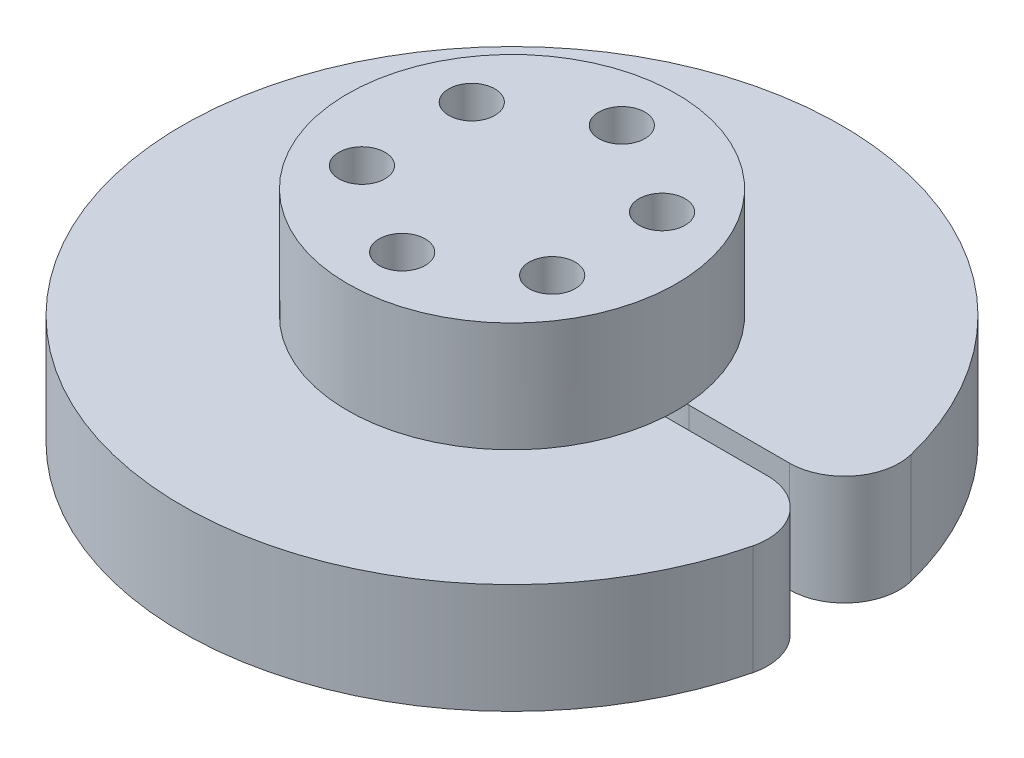
ISO-10303-21;
HEADER;
FILE_DESCRIPTION(('STEP AP214'),'2;1');
FILE_NAME('part.step','',(''),(''),'','','');
FILE_SCHEMA(('AUTOMOTIVE_DESIGN { 1 0 10303 214 1 1 1 1 }'));
ENDSEC;
DATA;
#1=APPLICATION_CONTEXT('core data for automotive mechanical design processes');
#2=APPLICATION_PROTOCOL_DEFINITION('international standard','automotive_design',2000,#1);
#3=PRODUCT_CONTEXT('',#1,'mechanical');
#4=PRODUCT('Part','Part','',(#3));
#5=PRODUCT_RELATED_PRODUCT_CATEGORY('part','',(#4));
#6=PRODUCT_DEFINITION_FORMATION('','',#4);
#7=PRODUCT_DEFINITION_CONTEXT('part definition',#1,'design');
#8=PRODUCT_DEFINITION('design','',#6,#7);
#9=PRODUCT_DEFINITION_SHAPE('','',#8);
#10=(LENGTH_UNIT() NAMED_UNIT(*) SI_UNIT(.MILLI.,.METRE.));
#11=(NAMED_UNIT(*) PLANE_ANGLE_UNIT() SI_UNIT($,.RADIAN.));
#12=(NAMED_UNIT(*) SI_UNIT($,.STERADIAN.) SOLID_ANGLE_UNIT());
#13=UNCERTAINTY_MEASURE_WITH_UNIT(LENGTH_MEASURE(1.E-05),#10,'distance_accuracy_value','');
#14=(GEOMETRIC_REPRESENTATION_CONTEXT(3) GLOBAL_UNCERTAINTY_ASSIGNED_CONTEXT((#13)) GLOBAL_UNIT_ASSIGNED_CONTEXT((#10,
#11,#12)) REPRESENTATION_CONTEXT('',''));
#15=CARTESIAN_POINT('',(0.,0.,0.));
#16=DIRECTION('',(0.,0.,1.));
#17=DIRECTION('',(1.,0.,0.));
#18=AXIS2_PLACEMENT_3D('',#15,#16,#17);
#19=CARTESIAN_POINT('',(0.,10.,0.));
#20=DIRECTION('',(0.,-1.,0.));
#21=DIRECTION('',(0.,0.,-1.));
#22=AXIS2_PLACEMENT_3D('',#19,#20,#21);
#23=CYLINDRICAL_SURFACE('',#22,30.);
#24=CARTESIAN_POINT('',(0.,10.,0.));
#25=DIRECTION('',(0.,1.,0.));
#26=DIRECTION('',(0.,0.,1.));
#27=AXIS2_PLACEMENT_3D('',#24,#25,#26);
#28=CIRCLE('',#27,30.);
#29=CARTESIAN_POINT('',(29.1231866388278,10.,-7.2));
#30=VERTEX_POINT('',#29);
#31=CARTESIAN_POINT('',(29.1231866388278,10.,7.2));
#32=VERTEX_POINT('',#31);
#33=EDGE_CURVE('E222',#30,#32,#28,.T.);
#34=ORIENTED_EDGE('',*,*,#33,.F.);
#35=DIRECTION('',(0.,-1.,0.));
#36=VECTOR('',#35,1.);
#37=CARTESIAN_POINT('',(29.1231866388278,10.,-7.2));
#38=LINE('',#37,#36);
#39=CARTESIAN_POINT('',(29.1231866388278,0.,-7.2));
#40=VERTEX_POINT('',#39);
#41=EDGE_CURVE('E248',#30,#40,#38,.T.);
#42=ORIENTED_EDGE('',*,*,#41,.T.);
#43=CARTESIAN_POINT('',(0.,0.,0.));
#44=DIRECTION('',(0.,1.,0.));
#45=DIRECTION('',(0.,0.,1.));
#46=AXIS2_PLACEMENT_3D('',#43,#44,#45);
#47=CIRCLE('',#46,30.);
#48=CARTESIAN_POINT('',(29.1231866388278,0.,7.2));
#49=VERTEX_POINT('',#48);
#50=EDGE_CURVE('E219',#40,#49,#47,.T.);
#51=ORIENTED_EDGE('',*,*,#50,.T.);
#52=DIRECTION('',(0.,-1.,0.));
#53=VECTOR('',#52,1.);
#54=CARTESIAN_POINT('',(29.1231866388278,10.,7.2));
#55=LINE('',#54,#53);
#56=EDGE_CURVE('E245',#49,#32,#55,.F.);
#57=ORIENTED_EDGE('',*,*,#56,.T.);
#58=EDGE_LOOP('',(#34,#42,#51,#57));
#59=FACE_BOUND('',#58,.T.);
#60=ADVANCED_FACE('F42',(#59),#23,.T.);
#61=CARTESIAN_POINT('',(0.,10.,0.));
#62=DIRECTION('',(0.,1.,0.));
#63=DIRECTION('',(0.,0.,1.));
#64=AXIS2_PLACEMENT_3D('',#61,#62,#63);
#65=PLANE('',#64);
#66=DIRECTION('',(-1.,0.,0.));
#67=VECTOR('',#66,1.);
#68=CARTESIAN_POINT('',(10.9342801502242,10.,-1.));
#69=LINE('',#68,#67);
#70=CARTESIAN_POINT('',(24.2693221990232,10.,-1.));
#71=VERTEX_POINT('',#70);
#72=CARTESIAN_POINT('',(15.114070564733,10.,-1.));
#73=VERTEX_POINT('',#72);
#74=EDGE_CURVE('E166',#71,#73,#69,.T.);
#75=ORIENTED_EDGE('',*,*,#74,.F.);
#76=CARTESIAN_POINT('',(24.2693221990232,10.,-6.));
#77=DIRECTION('',(0.,1.,0.));
#78=DIRECTION('',(0.,0.,1.));
#79=AXIS2_PLACEMENT_3D('',#76,#77,#78);
#80=CIRCLE('',#79,5.);
#81=EDGE_CURVE('E259',#71,#30,#80,.T.);
#82=ORIENTED_EDGE('',*,*,#81,.T.);
#83=ORIENTED_EDGE('',*,*,#33,.T.);
#84=CARTESIAN_POINT('',(24.2693221990232,10.,6.));
#85=DIRECTION('',(0.,1.,0.));
#86=DIRECTION('',(0.,0.,1.));
#87=AXIS2_PLACEMENT_3D('',#84,#85,#86);
#88=CIRCLE('',#87,5.);
#89=CARTESIAN_POINT('',(24.2693221990232,10.,1.));
#90=VERTEX_POINT('',#89);
#91=EDGE_CURVE('E257',#32,#90,#88,.T.);
#92=ORIENTED_EDGE('',*,*,#91,.T.);
#93=DIRECTION('',(1.,0.,0.));
#94=VECTOR('',#93,1.);
#95=CARTESIAN_POINT('',(10.9342801502242,10.,1.));
#96=LINE('',#95,#94);
#97=CARTESIAN_POINT('',(15.114070564733,10.,1.));
#98=VERTEX_POINT('',#97);
#99=EDGE_CURVE('E162',#98,#90,#96,.T.);
#100=ORIENTED_EDGE('',*,*,#99,.F.);
#101=CARTESIAN_POINT('',(15.114070564733,10.,11.));
#102=DIRECTION('',(0.,1.,0.));
#103=DIRECTION('',(0.,0.,1.));
#104=AXIS2_PLACEMENT_3D('',#101,#102,#103);
#105=CIRCLE('',#104,10.);
#106=CARTESIAN_POINT('',(14.9414739433517,10.,1.00148959062962));
#107=VERTEX_POINT('',#106);
#108=EDGE_CURVE('E157',#98,#107,#105,.T.);
#109=ORIENTED_EDGE('',*,*,#108,.T.);
#110=CARTESIAN_POINT('',(0.,10.,0.));
#111=DIRECTION('',(0.,1.,0.));
#112=DIRECTION('',(0.,0.,1.));
#113=AXIS2_PLACEMENT_3D('',#110,#111,#112);
#114=CIRCLE('',#113,14.975);
#115=CARTESIAN_POINT('',(14.9414739433517,10.,-1.00148959062962));
#116=VERTEX_POINT('',#115);
#117=EDGE_CURVE('E221',#116,#107,#114,.T.);
#118=ORIENTED_EDGE('',*,*,#117,.F.);
#119=CARTESIAN_POINT('',(15.114070564733,10.,-11.));
#120=DIRECTION('',(0.,1.,0.));
#121=DIRECTION('',(0.,0.,1.));
#122=AXIS2_PLACEMENT_3D('',#119,#120,#121);
#123=CIRCLE('',#122,10.);
#124=EDGE_CURVE('E143',#116,#73,#123,.T.);
#125=ORIENTED_EDGE('',*,*,#124,.T.);
#126=EDGE_LOOP('',(#75,#82,#83,#92,#100,#109,#118,#125));
#127=FACE_BOUND('',#126,.T.);
#128=ADVANCED_FACE('F311',(#127),#65,.T.);
#129=CARTESIAN_POINT('',(0.,0.,0.));
#130=DIRECTION('',(0.,1.,0.));
#131=DIRECTION('',(0.,0.,1.));
#132=AXIS2_PLACEMENT_3D('',#129,#130,#131);
#133=PLANE('',#132);
#134=ORIENTED_EDGE('',*,*,#50,.F.);
#135=CARTESIAN_POINT('',(24.2693221990232,0.,-6.));
#136=DIRECTION('',(0.,1.,0.));
#137=DIRECTION('',(0.,0.,1.));
#138=AXIS2_PLACEMENT_3D('',#135,#136,#137);
#139=CIRCLE('',#138,5.);
#140=CARTESIAN_POINT('',(24.2693221990232,0.,-1.));
#141=VERTEX_POINT('',#140);
#142=EDGE_CURVE('E253',#40,#141,#139,.F.);
#143=ORIENTED_EDGE('',*,*,#142,.T.);
#144=DIRECTION('',(-1.,0.,0.));
#145=VECTOR('',#144,1.);
#146=CARTESIAN_POINT('',(0.,0.,-1.));
#147=LINE('',#146,#145);
#148=CARTESIAN_POINT('',(15.114070564733,0.,-1.));
#149=VERTEX_POINT('',#148);
#150=EDGE_CURVE('E178',#141,#149,#147,.T.);
#151=ORIENTED_EDGE('',*,*,#150,.T.);
#152=CARTESIAN_POINT('',(15.114070564733,0.,-11.));
#153=DIRECTION('',(0.,1.,0.));
#154=DIRECTION('',(0.,0.,1.));
#155=AXIS2_PLACEMENT_3D('',#152,#153,#154);
#156=CIRCLE('',#155,10.);
#157=CARTESIAN_POINT('',(14.7176297725128,0.,-1.00786135513203));
#158=VERTEX_POINT('',#157);
#159=EDGE_CURVE('E56',#149,#158,#156,.F.);
#160=ORIENTED_EDGE('',*,*,#159,.T.);
#161=CARTESIAN_POINT('',(14.7255585883572,0.,-1.20770412802939));
#162=DIRECTION('',(0.,1.,0.));
#163=DIRECTION('',(0.,0.,1.));
#164=AXIS2_PLACEMENT_3D('',#161,#162,#163);
#165=CIRCLE('',#164,0.2);
#166=CARTESIAN_POINT('',(14.92488933067,0.,-1.22405206884874));
#167=VERTEX_POINT('',#166);
#168=EDGE_CURVE('E11',#158,#167,#165,.T.);
#169=ORIENTED_EDGE('',*,*,#168,.T.);
#170=CARTESIAN_POINT('',(0.,0.,0.));
#171=DIRECTION('',(0.,-1.,0.));
#172=DIRECTION('',(0.,0.,-1.));
#173=AXIS2_PLACEMENT_3D('',#170,#171,#172);
#174=CIRCLE('',#173,14.975);
#175=CARTESIAN_POINT('',(14.92488933067,0.,1.22405206884874));
#176=VERTEX_POINT('',#175);
#177=EDGE_CURVE('E213',#176,#167,#174,.T.);
#178=ORIENTED_EDGE('',*,*,#177,.F.);
#179=CARTESIAN_POINT('',(14.7255585883572,0.,1.20770412802939));
#180=DIRECTION('',(0.,1.,0.));
#181=DIRECTION('',(0.,0.,1.));
#182=AXIS2_PLACEMENT_3D('',#179,#180,#181);
#183=CIRCLE('',#182,0.2);
#184=CARTESIAN_POINT('',(14.7176297725128,0.,1.00786135513203));
#185=VERTEX_POINT('',#184);
#186=EDGE_CURVE('E50',#176,#185,#183,.T.);
#187=ORIENTED_EDGE('',*,*,#186,.T.);
#188=CARTESIAN_POINT('',(15.114070564733,0.,11.));
#189=DIRECTION('',(0.,1.,0.));
#190=DIRECTION('',(0.,0.,1.));
#191=AXIS2_PLACEMENT_3D('',#188,#189,#190);
#192=CIRCLE('',#191,10.);
#193=CARTESIAN_POINT('',(15.114070564733,0.,1.));
#194=VERTEX_POINT('',#193);
#195=EDGE_CURVE('E234',#185,#194,#192,.F.);
#196=ORIENTED_EDGE('',*,*,#195,.T.);
#197=DIRECTION('',(1.,0.,0.));
#198=VECTOR('',#197,1.);
#199=CARTESIAN_POINT('',(0.,0.,1.));
#200=LINE('',#199,#198);
#201=CARTESIAN_POINT('',(24.2693221990232,0.,1.));
#202=VERTEX_POINT('',#201);
#203=EDGE_CURVE('E175',#194,#202,#200,.T.);
#204=ORIENTED_EDGE('',*,*,#203,.T.);
#205=CARTESIAN_POINT('',(24.2693221990232,0.,6.));
#206=DIRECTION('',(0.,1.,0.));
#207=DIRECTION('',(0.,0.,1.));
#208=AXIS2_PLACEMENT_3D('',#205,#206,#207);
#209=CIRCLE('',#208,5.);
#210=EDGE_CURVE('E251',#202,#49,#209,.F.);
#211=ORIENTED_EDGE('',*,*,#210,.T.);
#212=EDGE_LOOP('',(#134,#143,#151,#160,#169,#178,#187,#196,#204,#211));
#213=FACE_BOUND('',#212,.T.);
#214=ADVANCED_FACE('F279',(#213),#133,.F.);
#215=CARTESIAN_POINT('',(0.,20.,0.));
#216=DIRECTION('',(0.,-1.,0.));
#217=DIRECTION('',(0.,0.,-1.));
#218=AXIS2_PLACEMENT_3D('',#215,#216,#217);
#219=CYLINDRICAL_SURFACE('',#218,14.975);
#220=CARTESIAN_POINT('',(0.,20.,0.));
#221=DIRECTION('',(0.,1.,0.));
#222=DIRECTION('',(0.,0.,1.));
#223=AXIS2_PLACEMENT_3D('',#220,#221,#222);
#224=CIRCLE('',#223,14.975);
#225=CARTESIAN_POINT('',(0.,20.,14.975));
#226=VERTEX_POINT('',#225);
#227=EDGE_CURVE('E212',#226,#226,#224,.T.);
#228=ORIENTED_EDGE('',*,*,#227,.F.);
#229=EDGE_LOOP('',(#228));
#230=FACE_BOUND('',#229,.T.);
#231=EDGE_CURVE('E216',#107,#116,#114,.T.);
#232=ORIENTED_EDGE('',*,*,#231,.T.);
#233=ORIENTED_EDGE('',*,*,#117,.T.);
#234=EDGE_LOOP('',(#232,#233));
#235=FACE_BOUND('',#234,.T.);
#236=ADVANCED_FACE('F307',(#230,#235),#219,.T.);
#237=CARTESIAN_POINT('',(0.,20.,0.));
#238=DIRECTION('',(0.,1.,0.));
#239=DIRECTION('',(0.,0.,1.));
#240=AXIS2_PLACEMENT_3D('',#237,#238,#239);
#241=PLANE('',#240);
#242=CARTESIAN_POINT('',(-8.66025403784437,20.,5.00000000000003));
#243=DIRECTION('',(0.,1.,0.));
#244=DIRECTION('',(0.,0.,1.));
#245=AXIS2_PLACEMENT_3D('',#242,#243,#244);
#246=CIRCLE('',#245,2.1);
#247=CARTESIAN_POINT('',(-8.66025403784437,20.,7.10000000000003));
#248=VERTEX_POINT('',#247);
#249=EDGE_CURVE('E792',#248,#248,#246,.T.);
#250=ORIENTED_EDGE('',*,*,#249,.F.);
#251=EDGE_LOOP('',(#250));
#252=FACE_BOUND('',#251,.T.);
#253=CARTESIAN_POINT('',(0.,20.,10.));
#254=DIRECTION('',(0.,1.,0.));
#255=DIRECTION('',(0.,0.,1.));
#256=AXIS2_PLACEMENT_3D('',#253,#254,#255);
#257=CIRCLE('',#256,2.1);
#258=CARTESIAN_POINT('',(0.,20.,12.1));
#259=VERTEX_POINT('',#258);
#260=EDGE_CURVE('E829',#259,#259,#257,.T.);
#261=ORIENTED_EDGE('',*,*,#260,.F.);
#262=EDGE_LOOP('',(#261));
#263=FACE_BOUND('',#262,.T.);
#264=CARTESIAN_POINT('',(8.6602540378444,20.,4.99999999999998));
#265=DIRECTION('',(0.,1.,0.));
#266=DIRECTION('',(0.,0.,1.));
#267=AXIS2_PLACEMENT_3D('',#264,#265,#266);
#268=CIRCLE('',#267,2.1);
#269=CARTESIAN_POINT('',(8.6602540378444,20.,7.09999999999997));
#270=VERTEX_POINT('',#269);
#271=EDGE_CURVE('E823',#270,#270,#268,.T.);
#272=ORIENTED_EDGE('',*,*,#271,.F.);
#273=EDGE_LOOP('',(#272));
#274=FACE_BOUND('',#273,.T.);
#275=CARTESIAN_POINT('',(8.66025403784437,20.,-5.00000000000002));
#276=DIRECTION('',(0.,1.,0.));
#277=DIRECTION('',(0.,0.,1.));
#278=AXIS2_PLACEMENT_3D('',#275,#276,#277);
#279=CIRCLE('',#278,2.1);
#280=CARTESIAN_POINT('',(8.66025403784437,20.,-2.90000000000002));
#281=VERTEX_POINT('',#280);
#282=EDGE_CURVE('E815',#281,#281,#279,.T.);
#283=ORIENTED_EDGE('',*,*,#282,.F.);
#284=EDGE_LOOP('',(#283));
#285=FACE_BOUND('',#284,.T.);
#286=CARTESIAN_POINT('',(0.,20.,-10.));
#287=DIRECTION('',(0.,1.,0.));
#288=DIRECTION('',(0.,0.,1.));
#289=AXIS2_PLACEMENT_3D('',#286,#287,#288);
#290=CIRCLE('',#289,2.1);
#291=CARTESIAN_POINT('',(0.,20.,-7.90000000000001));
#292=VERTEX_POINT('',#291);
#293=EDGE_CURVE('E804',#292,#292,#290,.T.);
#294=ORIENTED_EDGE('',*,*,#293,.F.);
#295=EDGE_LOOP('',(#294));
#296=FACE_BOUND('',#295,.T.);
#297=CARTESIAN_POINT('',(-8.6602540378444,20.,-4.99999999999998));
#298=DIRECTION('',(0.,1.,0.));
#299=DIRECTION('',(0.,0.,1.));
#300=AXIS2_PLACEMENT_3D('',#297,#298,#299);
#301=CIRCLE('',#300,2.1);
#302=CARTESIAN_POINT('',(-8.6602540378444,20.,-2.89999999999998));
#303=VERTEX_POINT('',#302);
#304=EDGE_CURVE('E802',#303,#303,#301,.T.);
#305=ORIENTED_EDGE('',*,*,#304,.F.);
#306=EDGE_LOOP('',(#305));
#307=FACE_BOUND('',#306,.T.);
#308=ORIENTED_EDGE('',*,*,#227,.T.);
#309=EDGE_LOOP('',(#308));
#310=FACE_BOUND('',#309,.T.);
#311=ADVANCED_FACE('F299',(#252,#263,#274,#285,#296,#307,#310),#241,.T.);
#312=CARTESIAN_POINT('',(0.,-6.,0.));
#313=DIRECTION('',(0.,1.,0.));
#314=DIRECTION('',(0.,0.,1.));
#315=AXIS2_PLACEMENT_3D('',#312,#313,#314);
#316=CYLINDRICAL_SURFACE('',#315,14.975);
#317=CARTESIAN_POINT('',(0.,-6.,0.));
#318=DIRECTION('',(0.,-1.,0.));
#319=DIRECTION('',(0.,0.,-1.));
#320=AXIS2_PLACEMENT_3D('',#317,#318,#319);
#321=CIRCLE('',#320,14.975);
#322=CARTESIAN_POINT('',(14.92488933067,-6.,1.22405206884874));
#323=VERTEX_POINT('',#322);
#324=CARTESIAN_POINT('',(14.92488933067,-6.,-1.22405206884874));
#325=VERTEX_POINT('',#324);
#326=EDGE_CURVE('E184',#323,#325,#321,.T.);
#327=ORIENTED_EDGE('',*,*,#326,.F.);
#328=DIRECTION('',(0.,1.,0.));
#329=VECTOR('',#328,1.);
#330=CARTESIAN_POINT('',(14.92488933067,-6.,1.22405206884874));
#331=LINE('',#330,#329);
#332=EDGE_CURVE('E266',#323,#176,#331,.T.);
#333=ORIENTED_EDGE('',*,*,#332,.T.);
#334=ORIENTED_EDGE('',*,*,#177,.T.);
#335=DIRECTION('',(0.,1.,0.));
#336=VECTOR('',#335,1.);
#337=CARTESIAN_POINT('',(14.92488933067,-6.,-1.22405206884874));
#338=LINE('',#337,#336);
#339=EDGE_CURVE('E263',#167,#325,#338,.F.);
#340=ORIENTED_EDGE('',*,*,#339,.T.);
#341=EDGE_LOOP('',(#327,#333,#334,#340));
#342=FACE_BOUND('',#341,.T.);
#343=ADVANCED_FACE('F297',(#342),#316,.T.);
#344=CARTESIAN_POINT('',(0.,-6.,0.));
#345=DIRECTION('',(0.,-1.,0.));
#346=DIRECTION('',(0.,0.,-1.));
#347=AXIS2_PLACEMENT_3D('',#344,#345,#346);
#348=PLANE('',#347);
#349=CARTESIAN_POINT('',(15.114070564733,-6.,11.));
#350=DIRECTION('',(0.,-1.,0.));
#351=DIRECTION('',(0.,0.,-1.));
#352=AXIS2_PLACEMENT_3D('',#349,#350,#351);
#353=CIRCLE('',#352,10.);
#354=CARTESIAN_POINT('',(9.68348234737956,-6.,2.6030534351145));
#355=VERTEX_POINT('',#354);
#356=CARTESIAN_POINT('',(14.7176297725128,-6.,1.00786135513203));
#357=VERTEX_POINT('',#356);
#358=EDGE_CURVE('E237',#355,#357,#353,.T.);
#359=ORIENTED_EDGE('',*,*,#358,.T.);
#360=CARTESIAN_POINT('',(14.7255585883572,-6.,1.20770412802939));
#361=DIRECTION('',(0.,-1.,0.));
#362=DIRECTION('',(0.,0.,-1.));
#363=AXIS2_PLACEMENT_3D('',#360,#361,#362);
#364=CIRCLE('',#363,0.2);
#365=EDGE_CURVE('E272',#357,#323,#364,.T.);
#366=ORIENTED_EDGE('',*,*,#365,.T.);
#367=ORIENTED_EDGE('',*,*,#326,.T.);
#368=CARTESIAN_POINT('',(14.7255585883572,-6.,-1.20770412802939));
#369=DIRECTION('',(0.,-1.,0.));
#370=DIRECTION('',(0.,0.,-1.));
#371=AXIS2_PLACEMENT_3D('',#368,#369,#370);
#372=CIRCLE('',#371,0.2);
#373=CARTESIAN_POINT('',(14.7176297725128,-6.,-1.00786135513203));
#374=VERTEX_POINT('',#373);
#375=EDGE_CURVE('E64',#325,#374,#372,.T.);
#376=ORIENTED_EDGE('',*,*,#375,.T.);
#377=CARTESIAN_POINT('',(15.114070564733,-6.,-11.));
#378=DIRECTION('',(0.,-1.,0.));
#379=DIRECTION('',(0.,0.,-1.));
#380=AXIS2_PLACEMENT_3D('',#377,#378,#379);
#381=CIRCLE('',#380,10.);
#382=CARTESIAN_POINT('',(9.68348234737956,-6.,-2.6030534351145));
#383=VERTEX_POINT('',#382);
#384=EDGE_CURVE('E240',#374,#383,#381,.T.);
#385=ORIENTED_EDGE('',*,*,#384,.T.);
#386=CARTESIAN_POINT('',(8.,-6.,0.));
#387=DIRECTION('',(0.,1.,0.));
#388=DIRECTION('',(0.,0.,1.));
#389=AXIS2_PLACEMENT_3D('',#386,#387,#388);
#390=CIRCLE('',#389,3.1);
#391=EDGE_CURVE('E156',#383,#355,#390,.T.);
#392=ORIENTED_EDGE('',*,*,#391,.T.);
#393=EDGE_LOOP('',(#359,#366,#367,#376,#385,#392));
#394=FACE_BOUND('',#393,.T.);
#395=CARTESIAN_POINT('',(-10.,-6.,0.));
#396=DIRECTION('',(0.,-1.,0.));
#397=DIRECTION('',(0.,0.,-1.));
#398=AXIS2_PLACEMENT_3D('',#395,#396,#397);
#399=CIRCLE('',#398,2.1);
#400=CARTESIAN_POINT('',(-10.,-6.,-2.1));
#401=VERTEX_POINT('',#400);
#402=EDGE_CURVE('E185',#401,#401,#399,.T.);
#403=ORIENTED_EDGE('',*,*,#402,.F.);
#404=EDGE_LOOP('',(#403));
#405=FACE_BOUND('',#404,.T.);
#406=CARTESIAN_POINT('',(-5.,-6.,8.66025403784439));
#407=DIRECTION('',(0.,-1.,0.));
#408=DIRECTION('',(0.,0.,-1.));
#409=AXIS2_PLACEMENT_3D('',#406,#407,#408);
#410=CIRCLE('',#409,2.1);
#411=CARTESIAN_POINT('',(-5.,-6.,6.56025403784438));
#412=VERTEX_POINT('',#411);
#413=EDGE_CURVE('E188',#412,#412,#410,.T.);
#414=ORIENTED_EDGE('',*,*,#413,.F.);
#415=EDGE_LOOP('',(#414));
#416=FACE_BOUND('',#415,.T.);
#417=CARTESIAN_POINT('',(5.,-6.,8.66025403784439));
#418=DIRECTION('',(0.,-1.,0.));
#419=DIRECTION('',(0.,0.,-1.));
#420=AXIS2_PLACEMENT_3D('',#417,#418,#419);
#421=CIRCLE('',#420,2.1);
#422=CARTESIAN_POINT('',(5.,-6.,6.56025403784439));
#423=VERTEX_POINT('',#422);
#424=EDGE_CURVE('E194',#423,#423,#421,.T.);
#425=ORIENTED_EDGE('',*,*,#424,.F.);
#426=EDGE_LOOP('',(#425));
#427=FACE_BOUND('',#426,.T.);
#428=CARTESIAN_POINT('',(5.,-6.,-8.66025403784439));
#429=DIRECTION('',(0.,-1.,0.));
#430=DIRECTION('',(0.,0.,-1.));
#431=AXIS2_PLACEMENT_3D('',#428,#429,#430);
#432=CIRCLE('',#431,2.1);
#433=CARTESIAN_POINT('',(5.,-6.,-10.7602540378444));
#434=VERTEX_POINT('',#433);
#435=EDGE_CURVE('E200',#434,#434,#432,.T.);
#436=ORIENTED_EDGE('',*,*,#435,.F.);
#437=EDGE_LOOP('',(#436));
#438=FACE_BOUND('',#437,.T.);
#439=CARTESIAN_POINT('',(-4.99999999999999,-6.,-8.66025403784439));
#440=DIRECTION('',(0.,-1.,0.));
#441=DIRECTION('',(0.,0.,-1.));
#442=AXIS2_PLACEMENT_3D('',#439,#440,#441);
#443=CIRCLE('',#442,2.1);
#444=CARTESIAN_POINT('',(-4.99999999999999,-6.,-10.7602540378444));
#445=VERTEX_POINT('',#444);
#446=EDGE_CURVE('E206',#445,#445,#443,.T.);
#447=ORIENTED_EDGE('',*,*,#446,.F.);
#448=EDGE_LOOP('',(#447));
#449=FACE_BOUND('',#448,.T.);
#450=ADVANCED_FACE('F289',(#394,#405,#416,#427,#438,#449),#348,.T.);
#451=CARTESIAN_POINT('',(-4.99999999999999,10.,-8.66025403784439));
#452=DIRECTION('',(0.,-1.,0.));
#453=DIRECTION('',(0.,0.,-1.));
#454=AXIS2_PLACEMENT_3D('',#451,#452,#453);
#455=CYLINDRICAL_SURFACE('',#454,2.1);
#456=CARTESIAN_POINT('',(-4.99999999999999,10.,-8.66025403784439));
#457=DIRECTION('',(0.,-1.,0.));
#458=DIRECTION('',(0.,0.,-1.));
#459=AXIS2_PLACEMENT_3D('',#456,#457,#458);
#460=CIRCLE('',#459,2.1);
#461=CARTESIAN_POINT('',(-4.99999999999999,10.,-10.7602540378444));
#462=VERTEX_POINT('',#461);
#463=EDGE_CURVE('E180',#462,#462,#460,.T.);
#464=ORIENTED_EDGE('',*,*,#463,.F.);
#465=EDGE_LOOP('',(#464));
#466=FACE_BOUND('',#465,.T.);
#467=ORIENTED_EDGE('',*,*,#446,.T.);
#468=EDGE_LOOP('',(#467));
#469=FACE_BOUND('',#468,.T.);
#470=ADVANCED_FACE('F305',(#466,#469),#455,.F.);
#471=CARTESIAN_POINT('',(-4.99999999999999,10.,-8.66025403784439));
#472=DIRECTION('',(0.,-1.,0.));
#473=DIRECTION('',(0.,0.,-1.));
#474=AXIS2_PLACEMENT_3D('',#471,#472,#473);
#475=PLANE('',#474);
#476=ORIENTED_EDGE('',*,*,#463,.T.);
#477=EDGE_LOOP('',(#476));
#478=FACE_BOUND('',#477,.T.);
#479=ADVANCED_FACE('F396',(#478),#475,.T.);
#480=CARTESIAN_POINT('',(5.,10.,-8.66025403784439));
#481=DIRECTION('',(0.,-1.,0.));
#482=DIRECTION('',(0.,0.,-1.));
#483=AXIS2_PLACEMENT_3D('',#480,#481,#482);
#484=CYLINDRICAL_SURFACE('',#483,2.1);
#485=CARTESIAN_POINT('',(5.,10.,-8.66025403784439));
#486=DIRECTION('',(0.,-1.,0.));
#487=DIRECTION('',(0.,0.,-1.));
#488=AXIS2_PLACEMENT_3D('',#485,#486,#487);
#489=CIRCLE('',#488,2.1);
#490=CARTESIAN_POINT('',(5.,10.,-10.7602540378444));
#491=VERTEX_POINT('',#490);
#492=EDGE_CURVE('E203',#491,#491,#489,.T.);
#493=ORIENTED_EDGE('',*,*,#492,.F.);
#494=EDGE_LOOP('',(#493));
#495=FACE_BOUND('',#494,.T.);
#496=ORIENTED_EDGE('',*,*,#435,.T.);
#497=EDGE_LOOP('',(#496));
#498=FACE_BOUND('',#497,.T.);
#499=ADVANCED_FACE('F393',(#495,#498),#484,.F.);
#500=CARTESIAN_POINT('',(5.,10.,-8.66025403784439));
#501=DIRECTION('',(0.,-1.,0.));
#502=DIRECTION('',(0.,0.,-1.));
#503=AXIS2_PLACEMENT_3D('',#500,#501,#502);
#504=PLANE('',#503);
#505=ORIENTED_EDGE('',*,*,#492,.T.);
#506=EDGE_LOOP('',(#505));
#507=FACE_BOUND('',#506,.T.);
#508=ADVANCED_FACE('F388',(#507),#504,.T.);
#509=CARTESIAN_POINT('',(5.,10.,8.66025403784439));
#510=DIRECTION('',(0.,-1.,0.));
#511=DIRECTION('',(0.,0.,-1.));
#512=AXIS2_PLACEMENT_3D('',#509,#510,#511);
#513=CYLINDRICAL_SURFACE('',#512,2.1);
#514=CARTESIAN_POINT('',(5.,10.,8.66025403784439));
#515=DIRECTION('',(0.,-1.,0.));
#516=DIRECTION('',(0.,0.,-1.));
#517=AXIS2_PLACEMENT_3D('',#514,#515,#516);
#518=CIRCLE('',#517,2.1);
#519=CARTESIAN_POINT('',(5.,10.,6.56025403784439));
#520=VERTEX_POINT('',#519);
#521=EDGE_CURVE('E197',#520,#520,#518,.T.);
#522=ORIENTED_EDGE('',*,*,#521,.F.);
#523=EDGE_LOOP('',(#522));
#524=FACE_BOUND('',#523,.T.);
#525=ORIENTED_EDGE('',*,*,#424,.T.);
#526=EDGE_LOOP('',(#525));
#527=FACE_BOUND('',#526,.T.);
#528=ADVANCED_FACE('F385',(#524,#527),#513,.F.);
#529=CARTESIAN_POINT('',(5.,10.,8.66025403784439));
#530=DIRECTION('',(0.,-1.,0.));
#531=DIRECTION('',(0.,0.,-1.));
#532=AXIS2_PLACEMENT_3D('',#529,#530,#531);
#533=PLANE('',#532);
#534=ORIENTED_EDGE('',*,*,#521,.T.);
#535=EDGE_LOOP('',(#534));
#536=FACE_BOUND('',#535,.T.);
#537=ADVANCED_FACE('F380',(#536),#533,.T.);
#538=CARTESIAN_POINT('',(-5.,10.,8.66025403784439));
#539=DIRECTION('',(0.,-1.,0.));
#540=DIRECTION('',(0.,0.,-1.));
#541=AXIS2_PLACEMENT_3D('',#538,#539,#540);
#542=CYLINDRICAL_SURFACE('',#541,2.1);
#543=CARTESIAN_POINT('',(-5.,10.,8.66025403784439));
#544=DIRECTION('',(0.,-1.,0.));
#545=DIRECTION('',(0.,0.,-1.));
#546=AXIS2_PLACEMENT_3D('',#543,#544,#545);
#547=CIRCLE('',#546,2.1);
#548=CARTESIAN_POINT('',(-5.,10.,6.56025403784438));
#549=VERTEX_POINT('',#548);
#550=EDGE_CURVE('E191',#549,#549,#547,.T.);
#551=ORIENTED_EDGE('',*,*,#550,.F.);
#552=EDGE_LOOP('',(#551));
#553=FACE_BOUND('',#552,.T.);
#554=ORIENTED_EDGE('',*,*,#413,.T.);
#555=EDGE_LOOP('',(#554));
#556=FACE_BOUND('',#555,.T.);
#557=ADVANCED_FACE('F377',(#553,#556),#542,.F.);
#558=CARTESIAN_POINT('',(-5.,10.,8.66025403784439));
#559=DIRECTION('',(0.,-1.,0.));
#560=DIRECTION('',(0.,0.,-1.));
#561=AXIS2_PLACEMENT_3D('',#558,#559,#560);
#562=PLANE('',#561);
#563=ORIENTED_EDGE('',*,*,#550,.T.);
#564=EDGE_LOOP('',(#563));
#565=FACE_BOUND('',#564,.T.);
#566=ADVANCED_FACE('F375',(#565),#562,.T.);
#567=CARTESIAN_POINT('',(-10.,10.,0.));
#568=DIRECTION('',(0.,-1.,0.));
#569=DIRECTION('',(0.,0.,-1.));
#570=AXIS2_PLACEMENT_3D('',#567,#568,#569);
#571=CYLINDRICAL_SURFACE('',#570,2.1);
#572=CARTESIAN_POINT('',(-10.,10.,0.));
#573=DIRECTION('',(0.,-1.,0.));
#574=DIRECTION('',(0.,0.,-1.));
#575=AXIS2_PLACEMENT_3D('',#572,#573,#574);
#576=CIRCLE('',#575,2.1);
#577=CARTESIAN_POINT('',(-10.,10.,-2.1));
#578=VERTEX_POINT('',#577);
#579=EDGE_CURVE('E181',#578,#578,#576,.T.);
#580=ORIENTED_EDGE('',*,*,#579,.F.);
#581=EDGE_LOOP('',(#580));
#582=FACE_BOUND('',#581,.T.);
#583=ORIENTED_EDGE('',*,*,#402,.T.);
#584=EDGE_LOOP('',(#583));
#585=FACE_BOUND('',#584,.T.);
#586=ADVANCED_FACE('F371',(#582,#585),#571,.F.);
#587=CARTESIAN_POINT('',(-10.,10.,0.));
#588=DIRECTION('',(0.,-1.,0.));
#589=DIRECTION('',(0.,0.,-1.));
#590=AXIS2_PLACEMENT_3D('',#587,#588,#589);
#591=PLANE('',#590);
#592=ORIENTED_EDGE('',*,*,#579,.T.);
#593=EDGE_LOOP('',(#592));
#594=FACE_BOUND('',#593,.T.);
#595=ADVANCED_FACE('F358',(#594),#591,.T.);
#596=CARTESIAN_POINT('',(8.,10.,0.));
#597=DIRECTION('',(0.,1.,0.));
#598=DIRECTION('',(0.,0.,1.));
#599=AXIS2_PLACEMENT_3D('',#596,#597,#598);
#600=PLANE('',#599);
#601=CARTESIAN_POINT('',(8.,10.,0.));
#602=DIRECTION('',(0.,-1.,0.));
#603=DIRECTION('',(0.,0.,-1.));
#604=AXIS2_PLACEMENT_3D('',#601,#602,#603);
#605=CIRCLE('',#604,1.25);
#606=CARTESIAN_POINT('',(8.,10.,-1.25));
#607=VERTEX_POINT('',#606);
#608=EDGE_CURVE('E169',#607,#607,#605,.T.);
#609=ORIENTED_EDGE('',*,*,#608,.F.);
#610=EDGE_LOOP('',(#609));
#611=FACE_BOUND('',#610,.T.);
#612=ORIENTED_EDGE('',*,*,#231,.F.);
#613=CARTESIAN_POINT('',(15.114070564733,10.,11.));
#614=DIRECTION('',(0.,1.,0.));
#615=DIRECTION('',(0.,0.,1.));
#616=AXIS2_PLACEMENT_3D('',#613,#614,#615);
#617=CIRCLE('',#616,10.);
#618=CARTESIAN_POINT('',(9.68348234737956,10.,2.6030534351145));
#619=VERTEX_POINT('',#618);
#620=EDGE_CURVE('E146',#107,#619,#617,.T.);
#621=ORIENTED_EDGE('',*,*,#620,.T.);
#622=CARTESIAN_POINT('',(8.,10.,0.));
#623=DIRECTION('',(0.,1.,0.));
#624=DIRECTION('',(0.,0.,1.));
#625=AXIS2_PLACEMENT_3D('',#622,#623,#624);
#626=CIRCLE('',#625,3.1);
#627=CARTESIAN_POINT('',(9.68348234737956,10.,-2.6030534351145));
#628=VERTEX_POINT('',#627);
#629=EDGE_CURVE('E153',#628,#619,#626,.T.);
#630=ORIENTED_EDGE('',*,*,#629,.F.);
#631=CARTESIAN_POINT('',(15.114070564733,10.,-11.));
#632=DIRECTION('',(0.,1.,0.));
#633=DIRECTION('',(0.,0.,1.));
#634=AXIS2_PLACEMENT_3D('',#631,#632,#633);
#635=CIRCLE('',#634,10.);
#636=EDGE_CURVE('E137',#628,#116,#635,.T.);
#637=ORIENTED_EDGE('',*,*,#636,.T.);
#638=EDGE_LOOP('',(#612,#621,#630,#637));
#639=FACE_BOUND('',#638,.T.);
#640=ADVANCED_FACE('F160',(#611,#639),#600,.F.);
#641=CARTESIAN_POINT('',(10.9342801502242,-6.,-1.));
#642=DIRECTION('',(0.,0.,-1.));
#643=DIRECTION('',(-1.,0.,0.));
#644=AXIS2_PLACEMENT_3D('',#641,#642,#643);
#645=PLANE('',#644);
#646=ORIENTED_EDGE('',*,*,#150,.F.);
#647=DIRECTION('',(0.,-1.,0.));
#648=VECTOR('',#647,1.);
#649=CARTESIAN_POINT('',(24.2693221990232,-6.,-1.));
#650=LINE('',#649,#648);
#651=EDGE_CURVE('E255',#141,#71,#650,.F.);
#652=ORIENTED_EDGE('',*,*,#651,.T.);
#653=ORIENTED_EDGE('',*,*,#74,.T.);
#654=DIRECTION('',(0.,1.,0.));
#655=VECTOR('',#654,1.);
#656=CARTESIAN_POINT('',(15.114070564733,-6.,-1.));
#657=LINE('',#656,#655);
#658=EDGE_CURVE('E231',#73,#149,#657,.F.);
#659=ORIENTED_EDGE('',*,*,#658,.T.);
#660=EDGE_LOOP('',(#646,#652,#653,#659));
#661=FACE_BOUND('',#660,.T.);
#662=ADVANCED_FACE('F357',(#661),#645,.F.);
#663=CARTESIAN_POINT('',(10.9342801502242,-6.,1.));
#664=DIRECTION('',(0.,0.,1.));
#665=DIRECTION('',(1.,0.,0.));
#666=AXIS2_PLACEMENT_3D('',#663,#664,#665);
#667=PLANE('',#666);
#668=ORIENTED_EDGE('',*,*,#99,.T.);
#669=DIRECTION('',(0.,-1.,0.));
#670=VECTOR('',#669,1.);
#671=CARTESIAN_POINT('',(24.2693221990232,-6.,1.));
#672=LINE('',#671,#670);
#673=EDGE_CURVE('E261',#90,#202,#672,.T.);
#674=ORIENTED_EDGE('',*,*,#673,.T.);
#675=ORIENTED_EDGE('',*,*,#203,.F.);
#676=DIRECTION('',(0.,1.,0.));
#677=VECTOR('',#676,1.);
#678=CARTESIAN_POINT('',(15.114070564733,-6.,1.));
#679=LINE('',#678,#677);
#680=EDGE_CURVE('E147',#194,#98,#679,.T.);
#681=ORIENTED_EDGE('',*,*,#680,.T.);
#682=EDGE_LOOP('',(#668,#674,#675,#681));
#683=FACE_BOUND('',#682,.T.);
#684=ADVANCED_FACE('F362',(#683),#667,.F.);
#685=CARTESIAN_POINT('',(8.,-6.,0.));
#686=DIRECTION('',(0.,1.,0.));
#687=DIRECTION('',(0.,0.,1.));
#688=AXIS2_PLACEMENT_3D('',#685,#686,#687);
#689=CYLINDRICAL_SURFACE('',#688,3.1);
#690=ORIENTED_EDGE('',*,*,#391,.F.);
#691=DIRECTION('',(0.,1.,0.));
#692=VECTOR('',#691,1.);
#693=CARTESIAN_POINT('',(9.68348234737956,-6.,-2.6030534351145));
#694=LINE('',#693,#692);
#695=EDGE_CURVE('E140',#383,#628,#694,.T.);
#696=ORIENTED_EDGE('',*,*,#695,.T.);
#697=ORIENTED_EDGE('',*,*,#629,.T.);
#698=DIRECTION('',(0.,1.,0.));
#699=VECTOR('',#698,1.);
#700=CARTESIAN_POINT('',(9.68348234737956,-6.,2.6030534351145));
#701=LINE('',#700,#699);
#702=EDGE_CURVE('E158',#619,#355,#701,.F.);
#703=ORIENTED_EDGE('',*,*,#702,.T.);
#704=EDGE_LOOP('',(#690,#696,#697,#703));
#705=FACE_BOUND('',#704,.T.);
#706=ADVANCED_FACE('F152',(#705),#689,.F.);
#707=CARTESIAN_POINT('',(15.114070564733,-6.,-11.));
#708=DIRECTION('',(0.,1.,0.));
#709=DIRECTION('',(0.,0.,1.));
#710=AXIS2_PLACEMENT_3D('',#707,#708,#709);
#711=CYLINDRICAL_SURFACE('',#710,10.);
#712=ORIENTED_EDGE('',*,*,#384,.F.);
#713=DIRECTION('',(0.,1.,0.));
#714=VECTOR('',#713,1.);
#715=CARTESIAN_POINT('',(14.7176297725128,-6.,-1.00786135513203));
#716=LINE('',#715,#714);
#717=EDGE_CURVE('E274',#374,#158,#716,.T.);
#718=ORIENTED_EDGE('',*,*,#717,.T.);
#719=ORIENTED_EDGE('',*,*,#159,.F.);
#720=ORIENTED_EDGE('',*,*,#658,.F.);
#721=ORIENTED_EDGE('',*,*,#124,.F.);
#722=ORIENTED_EDGE('',*,*,#636,.F.);
#723=ORIENTED_EDGE('',*,*,#695,.F.);
#724=EDGE_LOOP('',(#712,#718,#719,#720,#721,#722,#723));
#725=FACE_BOUND('',#724,.T.);
#726=ADVANCED_FACE('F139',(#725),#711,.T.);
#727=CARTESIAN_POINT('',(15.114070564733,-6.,11.));
#728=DIRECTION('',(0.,1.,0.));
#729=DIRECTION('',(0.,0.,1.));
#730=AXIS2_PLACEMENT_3D('',#727,#728,#729);
#731=CYLINDRICAL_SURFACE('',#730,10.);
#732=ORIENTED_EDGE('',*,*,#195,.F.);
#733=DIRECTION('',(0.,1.,0.));
#734=VECTOR('',#733,1.);
#735=CARTESIAN_POINT('',(14.7176297725128,-6.,1.00786135513203));
#736=LINE('',#735,#734);
#737=EDGE_CURVE('E269',#185,#357,#736,.F.);
#738=ORIENTED_EDGE('',*,*,#737,.T.);
#739=ORIENTED_EDGE('',*,*,#358,.F.);
#740=ORIENTED_EDGE('',*,*,#702,.F.);
#741=ORIENTED_EDGE('',*,*,#620,.F.);
#742=ORIENTED_EDGE('',*,*,#108,.F.);
#743=ORIENTED_EDGE('',*,*,#680,.F.);
#744=EDGE_LOOP('',(#732,#738,#739,#740,#741,#742,#743));
#745=FACE_BOUND('',#744,.T.);
#746=ADVANCED_FACE('F287',(#745),#731,.T.);
#747=CARTESIAN_POINT('',(24.2693221990232,10.,-6.));
#748=DIRECTION('',(0.,-1.,0.));
#749=DIRECTION('',(0.,0.,-1.));
#750=AXIS2_PLACEMENT_3D('',#747,#748,#749);
#751=CYLINDRICAL_SURFACE('',#750,5.);
#752=ORIENTED_EDGE('',*,*,#81,.F.);
#753=ORIENTED_EDGE('',*,*,#651,.F.);
#754=ORIENTED_EDGE('',*,*,#142,.F.);
#755=ORIENTED_EDGE('',*,*,#41,.F.);
#756=EDGE_LOOP('',(#752,#753,#754,#755));
#757=FACE_BOUND('',#756,.T.);
#758=ADVANCED_FACE('F327',(#757),#751,.T.);
#759=CARTESIAN_POINT('',(24.2693221990232,10.,6.));
#760=DIRECTION('',(0.,-1.,0.));
#761=DIRECTION('',(0.,0.,-1.));
#762=AXIS2_PLACEMENT_3D('',#759,#760,#761);
#763=CYLINDRICAL_SURFACE('',#762,5.);
#764=ORIENTED_EDGE('',*,*,#210,.F.);
#765=ORIENTED_EDGE('',*,*,#673,.F.);
#766=ORIENTED_EDGE('',*,*,#91,.F.);
#767=ORIENTED_EDGE('',*,*,#56,.F.);
#768=EDGE_LOOP('',(#764,#765,#766,#767));
#769=FACE_BOUND('',#768,.T.);
#770=ADVANCED_FACE('F330',(#769),#763,.T.);
#771=CARTESIAN_POINT('',(14.7255585883572,-6.,1.20770412802939));
#772=DIRECTION('',(0.,1.,0.));
#773=DIRECTION('',(0.,0.,1.));
#774=AXIS2_PLACEMENT_3D('',#771,#772,#773);
#775=CYLINDRICAL_SURFACE('',#774,0.2);
#776=ORIENTED_EDGE('',*,*,#365,.F.);
#777=ORIENTED_EDGE('',*,*,#737,.F.);
#778=ORIENTED_EDGE('',*,*,#186,.F.);
#779=ORIENTED_EDGE('',*,*,#332,.F.);
#780=EDGE_LOOP('',(#776,#777,#778,#779));
#781=FACE_BOUND('',#780,.T.);
#782=ADVANCED_FACE('F284',(#781),#775,.T.);
#783=CARTESIAN_POINT('',(14.7255585883572,-6.,-1.20770412802939));
#784=DIRECTION('',(0.,-1.,0.));
#785=DIRECTION('',(0.,0.,-1.));
#786=AXIS2_PLACEMENT_3D('',#783,#784,#785);
#787=CYLINDRICAL_SURFACE('',#786,0.2);
#788=ORIENTED_EDGE('',*,*,#168,.F.);
#789=ORIENTED_EDGE('',*,*,#717,.F.);
#790=ORIENTED_EDGE('',*,*,#375,.F.);
#791=ORIENTED_EDGE('',*,*,#339,.F.);
#792=EDGE_LOOP('',(#788,#789,#790,#791));
#793=FACE_BOUND('',#792,.T.);
#794=ADVANCED_FACE('F44',(#793),#787,.T.);
#795=CARTESIAN_POINT('',(8.,18.,0.));
#796=DIRECTION('',(0.,-1.,0.));
#797=DIRECTION('',(0.,0.,-1.));
#798=AXIS2_PLACEMENT_3D('',#795,#796,#797);
#799=CYLINDRICAL_SURFACE('',#798,1.25);
#800=CARTESIAN_POINT('',(8.,18.,0.));
#801=DIRECTION('',(0.,-1.,0.));
#802=DIRECTION('',(0.,0.,-1.));
#803=AXIS2_PLACEMENT_3D('',#800,#801,#802);
#804=CIRCLE('',#803,1.25);
#805=CARTESIAN_POINT('',(8.,18.,-1.25));
#806=VERTEX_POINT('',#805);
#807=EDGE_CURVE('E163',#806,#806,#804,.T.);
#808=ORIENTED_EDGE('',*,*,#807,.F.);
#809=EDGE_LOOP('',(#808));
#810=FACE_BOUND('',#809,.T.);
#811=ORIENTED_EDGE('',*,*,#608,.T.);
#812=EDGE_LOOP('',(#811));
#813=FACE_BOUND('',#812,.T.);
#814=ADVANCED_FACE('F338',(#810,#813),#799,.F.);
#815=CARTESIAN_POINT('',(8.,18.,0.));
#816=DIRECTION('',(0.,-1.,0.));
#817=DIRECTION('',(0.,0.,-1.));
#818=AXIS2_PLACEMENT_3D('',#815,#816,#817);
#819=PLANE('',#818);
#820=ORIENTED_EDGE('',*,*,#807,.T.);
#821=EDGE_LOOP('',(#820));
#822=FACE_BOUND('',#821,.T.);
#823=ADVANCED_FACE('F342',(#822),#819,.T.);
#824=CARTESIAN_POINT('',(-8.6602540378444,15.,-4.99999999999998));
#825=DIRECTION('',(0.,1.,0.));
#826=DIRECTION('',(0.,0.,1.));
#827=AXIS2_PLACEMENT_3D('',#824,#825,#826);
#828=CYLINDRICAL_SURFACE('',#827,2.1);
#829=CARTESIAN_POINT('',(-8.6602540378444,15.,-4.99999999999998));
#830=DIRECTION('',(0.,1.,0.));
#831=DIRECTION('',(0.,0.,1.));
#832=AXIS2_PLACEMENT_3D('',#829,#830,#831);
#833=CIRCLE('',#832,2.1);
#834=CARTESIAN_POINT('',(-8.6602540378444,15.,-2.89999999999998));
#835=VERTEX_POINT('',#834);
#836=EDGE_CURVE('E799',#835,#835,#833,.T.);
#837=ORIENTED_EDGE('',*,*,#836,.F.);
#838=EDGE_LOOP('',(#837));
#839=FACE_BOUND('',#838,.T.);
#840=ORIENTED_EDGE('',*,*,#304,.T.);
#841=EDGE_LOOP('',(#840));
#842=FACE_BOUND('',#841,.T.);
#843=ADVANCED_FACE('F348',(#839,#842),#828,.F.);
#844=CARTESIAN_POINT('',(-8.6602540378444,15.,-4.99999999999998));
#845=DIRECTION('',(0.,1.,0.));
#846=DIRECTION('',(0.,0.,1.));
#847=AXIS2_PLACEMENT_3D('',#844,#845,#846);
#848=PLANE('',#847);
#849=ORIENTED_EDGE('',*,*,#836,.T.);
#850=EDGE_LOOP('',(#849));
#851=FACE_BOUND('',#850,.T.);
#852=ADVANCED_FACE('F601',(#851),#848,.T.);
#853=CARTESIAN_POINT('',(0.,15.,-10.));
#854=DIRECTION('',(0.,1.,0.));
#855=DIRECTION('',(0.,0.,1.));
#856=AXIS2_PLACEMENT_3D('',#853,#854,#855);
#857=CYLINDRICAL_SURFACE('',#856,2.1);
#858=CARTESIAN_POINT('',(0.,15.,-10.));
#859=DIRECTION('',(0.,1.,0.));
#860=DIRECTION('',(0.,0.,1.));
#861=AXIS2_PLACEMENT_3D('',#858,#859,#860);
#862=CIRCLE('',#861,2.1);
#863=CARTESIAN_POINT('',(0.,15.,-7.90000000000001));
#864=VERTEX_POINT('',#863);
#865=EDGE_CURVE('E810',#864,#864,#862,.T.);
#866=ORIENTED_EDGE('',*,*,#865,.F.);
#867=EDGE_LOOP('',(#866));
#868=FACE_BOUND('',#867,.T.);
#869=ORIENTED_EDGE('',*,*,#293,.T.);
#870=EDGE_LOOP('',(#869));
#871=FACE_BOUND('',#870,.T.);
#872=ADVANCED_FACE('F610',(#868,#871),#857,.F.);
#873=CARTESIAN_POINT('',(0.,15.,-10.));
#874=DIRECTION('',(0.,1.,0.));
#875=DIRECTION('',(0.,0.,1.));
#876=AXIS2_PLACEMENT_3D('',#873,#874,#875);
#877=PLANE('',#876);
#878=ORIENTED_EDGE('',*,*,#865,.T.);
#879=EDGE_LOOP('',(#878));
#880=FACE_BOUND('',#879,.T.);
#881=ADVANCED_FACE('F620',(#880),#877,.T.);
#882=CARTESIAN_POINT('',(8.66025403784437,15.,-5.00000000000002));
#883=DIRECTION('',(0.,1.,0.));
#884=DIRECTION('',(0.,0.,1.));
#885=AXIS2_PLACEMENT_3D('',#882,#883,#884);
#886=CYLINDRICAL_SURFACE('',#885,2.1);
#887=CARTESIAN_POINT('',(8.66025403784437,15.,-5.00000000000002));
#888=DIRECTION('',(0.,1.,0.));
#889=DIRECTION('',(0.,0.,1.));
#890=AXIS2_PLACEMENT_3D('',#887,#888,#889);
#891=CIRCLE('',#890,2.1);
#892=CARTESIAN_POINT('',(8.66025403784437,15.,-2.90000000000002));
#893=VERTEX_POINT('',#892);
#894=EDGE_CURVE('E820',#893,#893,#891,.T.);
#895=ORIENTED_EDGE('',*,*,#894,.F.);
#896=EDGE_LOOP('',(#895));
#897=FACE_BOUND('',#896,.T.);
#898=ORIENTED_EDGE('',*,*,#282,.T.);
#899=EDGE_LOOP('',(#898));
#900=FACE_BOUND('',#899,.T.);
#901=ADVANCED_FACE('F630',(#897,#900),#886,.F.);
#902=CARTESIAN_POINT('',(8.66025403784437,15.,-5.00000000000002));
#903=DIRECTION('',(0.,1.,0.));
#904=DIRECTION('',(0.,0.,1.));
#905=AXIS2_PLACEMENT_3D('',#902,#903,#904);
#906=PLANE('',#905);
#907=ORIENTED_EDGE('',*,*,#894,.T.);
#908=EDGE_LOOP('',(#907));
#909=FACE_BOUND('',#908,.T.);
#910=ADVANCED_FACE('F640',(#909),#906,.T.);
#911=CARTESIAN_POINT('',(8.6602540378444,15.,4.99999999999998));
#912=DIRECTION('',(0.,1.,0.));
#913=DIRECTION('',(0.,0.,1.));
#914=AXIS2_PLACEMENT_3D('',#911,#912,#913);
#915=CYLINDRICAL_SURFACE('',#914,2.1);
#916=CARTESIAN_POINT('',(8.6602540378444,15.,4.99999999999998));
#917=DIRECTION('',(0.,1.,0.));
#918=DIRECTION('',(0.,0.,1.));
#919=AXIS2_PLACEMENT_3D('',#916,#917,#918);
#920=CIRCLE('',#919,2.1);
#921=CARTESIAN_POINT('',(8.6602540378444,15.,7.09999999999997));
#922=VERTEX_POINT('',#921);
#923=EDGE_CURVE('E826',#922,#922,#920,.T.);
#924=ORIENTED_EDGE('',*,*,#923,.F.);
#925=EDGE_LOOP('',(#924));
#926=FACE_BOUND('',#925,.T.);
#927=ORIENTED_EDGE('',*,*,#271,.T.);
#928=EDGE_LOOP('',(#927));
#929=FACE_BOUND('',#928,.T.);
#930=ADVANCED_FACE('F650',(#926,#929),#915,.F.);
#931=CARTESIAN_POINT('',(8.6602540378444,15.,4.99999999999998));
#932=DIRECTION('',(0.,1.,0.));
#933=DIRECTION('',(0.,0.,1.));
#934=AXIS2_PLACEMENT_3D('',#931,#932,#933);
#935=PLANE('',#934);
#936=ORIENTED_EDGE('',*,*,#923,.T.);
#937=EDGE_LOOP('',(#936));
#938=FACE_BOUND('',#937,.T.);
#939=ADVANCED_FACE('F660',(#938),#935,.T.);
#940=CARTESIAN_POINT('',(0.,15.,10.));
#941=DIRECTION('',(0.,1.,0.));
#942=DIRECTION('',(0.,0.,1.));
#943=AXIS2_PLACEMENT_3D('',#940,#941,#942);
#944=CYLINDRICAL_SURFACE('',#943,2.1);
#945=CARTESIAN_POINT('',(0.,15.,10.));
#946=DIRECTION('',(0.,1.,0.));
#947=DIRECTION('',(0.,0.,1.));
#948=AXIS2_PLACEMENT_3D('',#945,#946,#947);
#949=CIRCLE('',#948,2.1);
#950=CARTESIAN_POINT('',(0.,15.,12.1));
#951=VERTEX_POINT('',#950);
#952=EDGE_CURVE('E795',#951,#951,#949,.T.);
#953=ORIENTED_EDGE('',*,*,#952,.F.);
#954=EDGE_LOOP('',(#953));
#955=FACE_BOUND('',#954,.T.);
#956=ORIENTED_EDGE('',*,*,#260,.T.);
#957=EDGE_LOOP('',(#956));
#958=FACE_BOUND('',#957,.T.);
#959=ADVANCED_FACE('F670',(#955,#958),#944,.F.);
#960=CARTESIAN_POINT('',(0.,15.,10.));
#961=DIRECTION('',(0.,1.,0.));
#962=DIRECTION('',(0.,0.,1.));
#963=AXIS2_PLACEMENT_3D('',#960,#961,#962);
#964=PLANE('',#963);
#965=ORIENTED_EDGE('',*,*,#952,.T.);
#966=EDGE_LOOP('',(#965));
#967=FACE_BOUND('',#966,.T.);
#968=ADVANCED_FACE('F680',(#967),#964,.T.);
#969=CARTESIAN_POINT('',(-8.66025403784437,15.,5.00000000000003));
#970=DIRECTION('',(0.,1.,0.));
#971=DIRECTION('',(0.,0.,1.));
#972=AXIS2_PLACEMENT_3D('',#969,#970,#971);
#973=CYLINDRICAL_SURFACE('',#972,2.1);
#974=CARTESIAN_POINT('',(-8.66025403784437,15.,5.00000000000003));
#975=DIRECTION('',(0.,1.,0.));
#976=DIRECTION('',(0.,0.,1.));
#977=AXIS2_PLACEMENT_3D('',#974,#975,#976);
#978=CIRCLE('',#977,2.1);
#979=CARTESIAN_POINT('',(-8.66025403784437,15.,7.10000000000003));
#980=VERTEX_POINT('',#979);
#981=EDGE_CURVE('E791',#980,#980,#978,.T.);
#982=ORIENTED_EDGE('',*,*,#981,.F.);
#983=EDGE_LOOP('',(#982));
#984=FACE_BOUND('',#983,.T.);
#985=ORIENTED_EDGE('',*,*,#249,.T.);
#986=EDGE_LOOP('',(#985));
#987=FACE_BOUND('',#986,.T.);
#988=ADVANCED_FACE('F690',(#984,#987),#973,.F.);
#989=CARTESIAN_POINT('',(-8.66025403784437,15.,5.00000000000003));
#990=DIRECTION('',(0.,1.,0.));
#991=DIRECTION('',(0.,0.,1.));
#992=AXIS2_PLACEMENT_3D('',#989,#990,#991);
#993=PLANE('',#992);
#994=ORIENTED_EDGE('',*,*,#981,.T.);
#995=EDGE_LOOP('',(#994));
#996=FACE_BOUND('',#995,.T.);
#997=ADVANCED_FACE('F700',(#996),#993,.T.);
#998=CLOSED_SHELL('',(#60,#128,#214,#236,#311,#343,#450,#470,#479,#499,#508,#528,#537,#557,#566,
#586,#595,#640,#662,#684,#706,#726,#746,#758,#770,#782,#794,#814,#823,#843,#852,#872,#881,#901,
#910,#930,#939,#959,#968,#988,#997));
#999=MANIFOLD_SOLID_BREP('B2',#998);
#1000=ADVANCED_BREP_SHAPE_REPRESENTATION('',(#18,#999),#14);
#1001=SHAPE_DEFINITION_REPRESENTATION(#9,#1000);
ENDSEC;
END-ISO-10303-21;
